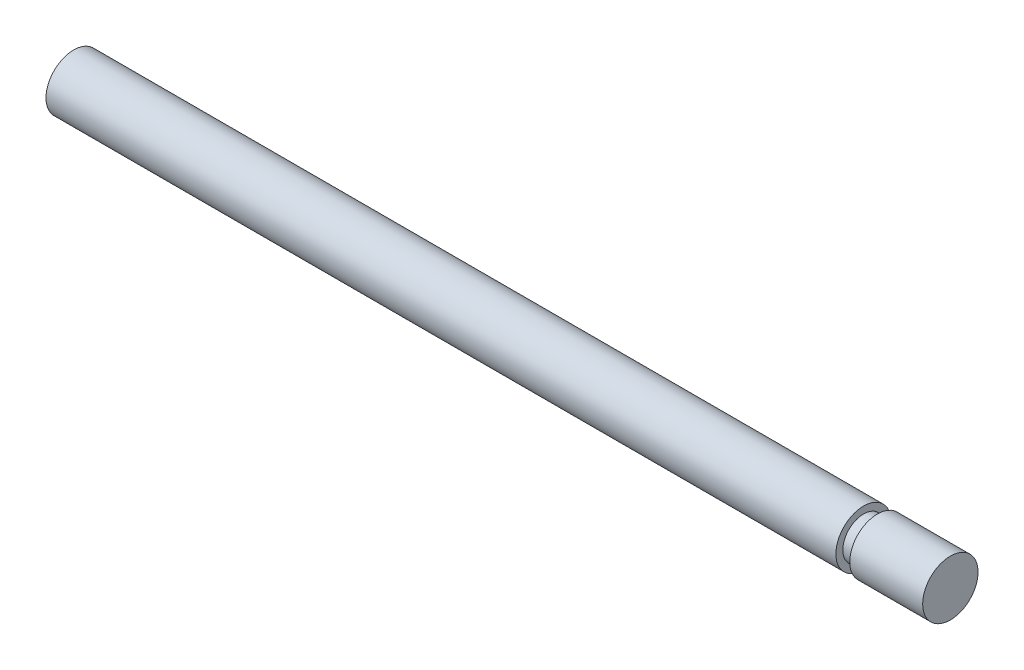
ISO-10303-21;
HEADER;
FILE_DESCRIPTION(('STEP AP214'),'2;1');
FILE_NAME('part.step','',(''),(''),'','','');
FILE_SCHEMA(('AUTOMOTIVE_DESIGN { 1 0 10303 214 1 1 1 1 }'));
ENDSEC;
DATA;
#1=APPLICATION_CONTEXT('core data for automotive mechanical design processes');
#2=APPLICATION_PROTOCOL_DEFINITION('international standard','automotive_design',2000,#1);
#3=PRODUCT_CONTEXT('',#1,'mechanical');
#4=PRODUCT('Part','Part','',(#3));
#5=PRODUCT_RELATED_PRODUCT_CATEGORY('part','',(#4));
#6=PRODUCT_DEFINITION_FORMATION('','',#4);
#7=PRODUCT_DEFINITION_CONTEXT('part definition',#1,'design');
#8=PRODUCT_DEFINITION('design','',#6,#7);
#9=PRODUCT_DEFINITION_SHAPE('','',#8);
#10=(LENGTH_UNIT() NAMED_UNIT(*) SI_UNIT(.MILLI.,.METRE.));
#11=(NAMED_UNIT(*) PLANE_ANGLE_UNIT() SI_UNIT($,.RADIAN.));
#12=(NAMED_UNIT(*) SI_UNIT($,.STERADIAN.) SOLID_ANGLE_UNIT());
#13=UNCERTAINTY_MEASURE_WITH_UNIT(LENGTH_MEASURE(1.E-05),#10,'distance_accuracy_value','');
#14=(GEOMETRIC_REPRESENTATION_CONTEXT(3) GLOBAL_UNCERTAINTY_ASSIGNED_CONTEXT((#13)) GLOBAL_UNIT_ASSIGNED_CONTEXT((#10,
#11,#12)) REPRESENTATION_CONTEXT('',''));
#15=CARTESIAN_POINT('',(0.,0.,0.));
#16=DIRECTION('',(0.,0.,1.));
#17=DIRECTION('',(1.,0.,0.));
#18=AXIS2_PLACEMENT_3D('',#15,#16,#17);
#19=CARTESIAN_POINT('',(1583.,0.,0.));
#20=DIRECTION('',(-1.,0.,0.));
#21=DIRECTION('',(0.,0.,1.));
#22=AXIS2_PLACEMENT_3D('',#19,#20,#21);
#23=PLANE('',#22);
#24=CARTESIAN_POINT('',(1583.,0.,0.));
#25=DIRECTION('',(-1.,0.,0.));
#26=DIRECTION('',(0.,0.,1.));
#27=AXIS2_PLACEMENT_3D('',#24,#25,#26);
#28=CIRCLE('',#27,50.);
#29=CARTESIAN_POINT('',(1583.,0.,50.));
#30=VERTEX_POINT('',#29);
#31=EDGE_CURVE('E10',#30,#30,#28,.T.);
#32=ORIENTED_EDGE('',*,*,#31,.F.);
#33=EDGE_LOOP('',(#32));
#34=FACE_BOUND('',#33,.T.);
#35=ADVANCED_FACE('F33',(#34),#23,.F.);
#36=CARTESIAN_POINT('',(0.,0.,0.));
#37=DIRECTION('',(-1.,0.,0.));
#38=DIRECTION('',(0.,0.,1.));
#39=AXIS2_PLACEMENT_3D('',#36,#37,#38);
#40=CYLINDRICAL_SURFACE('',#39,50.);
#41=CARTESIAN_POINT('',(1451.3,0.,0.));
#42=DIRECTION('',(-1.,0.,0.));
#43=DIRECTION('',(0.,0.,1.));
#44=AXIS2_PLACEMENT_3D('',#41,#42,#43);
#45=CIRCLE('',#44,50.);
#46=CARTESIAN_POINT('',(1451.3,0.,50.));
#47=VERTEX_POINT('',#46);
#48=EDGE_CURVE('E39',#47,#47,#45,.T.);
#49=ORIENTED_EDGE('',*,*,#48,.F.);
#50=EDGE_LOOP('',(#49));
#51=FACE_BOUND('',#50,.T.);
#52=ORIENTED_EDGE('',*,*,#31,.T.);
#53=EDGE_LOOP('',(#52));
#54=FACE_BOUND('',#53,.T.);
#55=ADVANCED_FACE('F81',(#51,#54),#40,.T.);
#56=CARTESIAN_POINT('',(1451.3,50.,0.));
#57=DIRECTION('',(1.,0.,0.));
#58=DIRECTION('',(0.,0.,-1.));
#59=AXIS2_PLACEMENT_3D('',#56,#57,#58);
#60=PLANE('',#59);
#61=CARTESIAN_POINT('',(1451.3,0.,0.));
#62=DIRECTION('',(-1.,0.,0.));
#63=DIRECTION('',(0.,0.,1.));
#64=AXIS2_PLACEMENT_3D('',#61,#62,#63);
#65=CIRCLE('',#64,37.5);
#66=CARTESIAN_POINT('',(1451.3,0.,37.5));
#67=VERTEX_POINT('',#66);
#68=EDGE_CURVE('E43',#67,#67,#65,.T.);
#69=ORIENTED_EDGE('',*,*,#68,.F.);
#70=EDGE_LOOP('',(#69));
#71=FACE_BOUND('',#70,.T.);
#72=ORIENTED_EDGE('',*,*,#48,.T.);
#73=EDGE_LOOP('',(#72));
#74=FACE_BOUND('',#73,.T.);
#75=ADVANCED_FACE('F76',(#71,#74),#60,.F.);
#76=CARTESIAN_POINT('',(0.,0.,0.));
#77=DIRECTION('',(-1.,0.,0.));
#78=DIRECTION('',(0.,0.,1.));
#79=AXIS2_PLACEMENT_3D('',#76,#77,#78);
#80=CYLINDRICAL_SURFACE('',#79,37.5);
#81=CARTESIAN_POINT('',(1426.3,0.,0.));
#82=DIRECTION('',(-1.,0.,0.));
#83=DIRECTION('',(0.,0.,1.));
#84=AXIS2_PLACEMENT_3D('',#81,#82,#83);
#85=CIRCLE('',#84,37.5);
#86=CARTESIAN_POINT('',(1426.3,0.,37.5));
#87=VERTEX_POINT('',#86);
#88=EDGE_CURVE('E47',#87,#87,#85,.T.);
#89=ORIENTED_EDGE('',*,*,#88,.F.);
#90=EDGE_LOOP('',(#89));
#91=FACE_BOUND('',#90,.T.);
#92=ORIENTED_EDGE('',*,*,#68,.T.);
#93=EDGE_LOOP('',(#92));
#94=FACE_BOUND('',#93,.T.);
#95=ADVANCED_FACE('F70',(#91,#94),#80,.T.);
#96=CARTESIAN_POINT('',(1426.3,37.5,0.));
#97=DIRECTION('',(-1.,0.,0.));
#98=DIRECTION('',(0.,0.,1.));
#99=AXIS2_PLACEMENT_3D('',#96,#97,#98);
#100=PLANE('',#99);
#101=CARTESIAN_POINT('',(1426.3,0.,0.));
#102=DIRECTION('',(-1.,0.,0.));
#103=DIRECTION('',(0.,0.,1.));
#104=AXIS2_PLACEMENT_3D('',#101,#102,#103);
#105=CIRCLE('',#104,50.);
#106=CARTESIAN_POINT('',(1426.3,0.,50.));
#107=VERTEX_POINT('',#106);
#108=EDGE_CURVE('E52',#107,#107,#105,.T.);
#109=ORIENTED_EDGE('',*,*,#108,.F.);
#110=EDGE_LOOP('',(#109));
#111=FACE_BOUND('',#110,.T.);
#112=ORIENTED_EDGE('',*,*,#88,.T.);
#113=EDGE_LOOP('',(#112));
#114=FACE_BOUND('',#113,.T.);
#115=ADVANCED_FACE('F64',(#111,#114),#100,.F.);
#116=CARTESIAN_POINT('',(0.,0.,0.));
#117=DIRECTION('',(-1.,0.,0.));
#118=DIRECTION('',(0.,0.,1.));
#119=AXIS2_PLACEMENT_3D('',#116,#117,#118);
#120=CYLINDRICAL_SURFACE('',#119,50.);
#121=CARTESIAN_POINT('',(0.,0.,0.));
#122=DIRECTION('',(-1.,0.,0.));
#123=DIRECTION('',(0.,0.,1.));
#124=AXIS2_PLACEMENT_3D('',#121,#122,#123);
#125=CIRCLE('',#124,50.);
#126=CARTESIAN_POINT('',(0.,0.,50.));
#127=VERTEX_POINT('',#126);
#128=EDGE_CURVE('E55',#127,#127,#125,.T.);
#129=ORIENTED_EDGE('',*,*,#128,.F.);
#130=EDGE_LOOP('',(#129));
#131=FACE_BOUND('',#130,.T.);
#132=ORIENTED_EDGE('',*,*,#108,.T.);
#133=EDGE_LOOP('',(#132));
#134=FACE_BOUND('',#133,.T.);
#135=ADVANCED_FACE('F61',(#131,#134),#120,.T.);
#136=CARTESIAN_POINT('',(0.,0.,0.));
#137=DIRECTION('',(1.,0.,0.));
#138=DIRECTION('',(0.,0.,-1.));
#139=AXIS2_PLACEMENT_3D('',#136,#137,#138);
#140=PLANE('',#139);
#141=ORIENTED_EDGE('',*,*,#128,.T.);
#142=EDGE_LOOP('',(#141));
#143=FACE_BOUND('',#142,.T.);
#144=ADVANCED_FACE('F59',(#143),#140,.F.);
#145=CLOSED_SHELL('',(#35,#55,#75,#95,#115,#135,#144));
#146=MANIFOLD_SOLID_BREP('B2',#145);
#147=ADVANCED_BREP_SHAPE_REPRESENTATION('',(#18,#146),#14);
#148=SHAPE_DEFINITION_REPRESENTATION(#9,#147);
ENDSEC;
END-ISO-10303-21;
